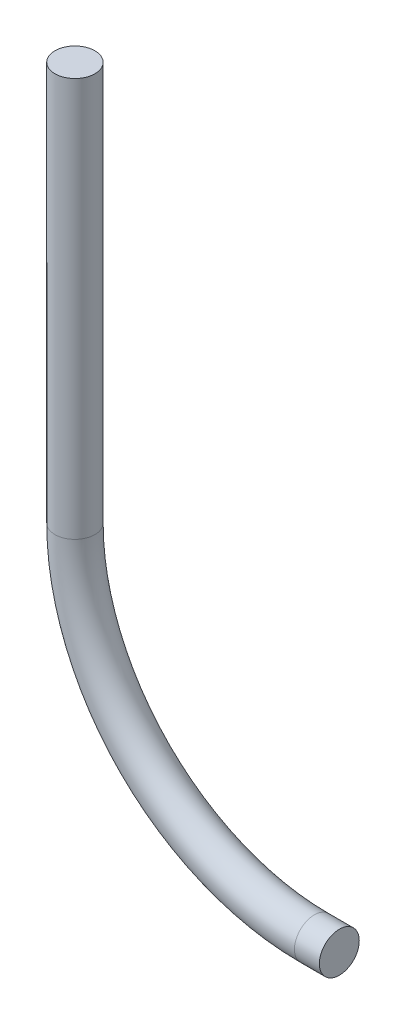
ISO-10303-21;
HEADER;
FILE_DESCRIPTION(('STEP AP214'),'2;1');
FILE_NAME('part.step','',(''),(''),'','','');
FILE_SCHEMA(('AUTOMOTIVE_DESIGN { 1 0 10303 214 1 1 1 1 }'));
ENDSEC;
DATA;
#1=APPLICATION_CONTEXT('core data for automotive mechanical design processes');
#2=APPLICATION_PROTOCOL_DEFINITION('international standard','automotive_design',2000,#1);
#3=PRODUCT_CONTEXT('',#1,'mechanical');
#4=PRODUCT('Part','Part','',(#3));
#5=PRODUCT_RELATED_PRODUCT_CATEGORY('part','',(#4));
#6=PRODUCT_DEFINITION_FORMATION('','',#4);
#7=PRODUCT_DEFINITION_CONTEXT('part definition',#1,'design');
#8=PRODUCT_DEFINITION('design','',#6,#7);
#9=PRODUCT_DEFINITION_SHAPE('','',#8);
#10=(LENGTH_UNIT() NAMED_UNIT(*) SI_UNIT(.MILLI.,.METRE.));
#11=(NAMED_UNIT(*) PLANE_ANGLE_UNIT() SI_UNIT($,.RADIAN.));
#12=(NAMED_UNIT(*) SI_UNIT($,.STERADIAN.) SOLID_ANGLE_UNIT());
#13=UNCERTAINTY_MEASURE_WITH_UNIT(LENGTH_MEASURE(1.E-05),#10,'distance_accuracy_value','');
#14=(GEOMETRIC_REPRESENTATION_CONTEXT(3) GLOBAL_UNCERTAINTY_ASSIGNED_CONTEXT((#13)) GLOBAL_UNIT_ASSIGNED_CONTEXT((#10,
#11,#12)) REPRESENTATION_CONTEXT('',''));
#15=CARTESIAN_POINT('',(0.,0.,0.));
#16=DIRECTION('',(0.,0.,1.));
#17=DIRECTION('',(1.,0.,0.));
#18=AXIS2_PLACEMENT_3D('',#15,#16,#17);
#19=CARTESIAN_POINT('',(0.,0.,0.));
#20=DIRECTION('',(1.,0.,0.));
#21=DIRECTION('',(0.,0.,-1.));
#22=AXIS2_PLACEMENT_3D('',#19,#20,#21);
#23=PLANE('',#22);
#24=CARTESIAN_POINT('',(0.,0.,0.));
#25=DIRECTION('',(1.,0.,0.));
#26=DIRECTION('',(0.,0.,-1.));
#27=AXIS2_PLACEMENT_3D('',#24,#25,#26);
#28=CIRCLE('',#27,4.);
#29=CARTESIAN_POINT('',(0.,0.,-4.));
#30=VERTEX_POINT('',#29);
#31=EDGE_CURVE('E47',#30,#30,#28,.T.);
#32=ORIENTED_EDGE('',*,*,#31,.T.);
#33=EDGE_LOOP('',(#32));
#34=FACE_BOUND('',#33,.T.);
#35=ADVANCED_FACE('F33',(#34),#23,.T.);
#36=CARTESIAN_POINT('',(-53.,128.,0.));
#37=DIRECTION('',(0.,-1.,0.));
#38=DIRECTION('',(0.,0.,-1.));
#39=AXIS2_PLACEMENT_3D('',#36,#37,#38);
#40=PLANE('',#39);
#41=CARTESIAN_POINT('',(-53.,128.,0.));
#42=DIRECTION('',(0.,-1.,0.));
#43=DIRECTION('',(0.,0.,-1.));
#44=AXIS2_PLACEMENT_3D('',#41,#42,#43);
#45=CIRCLE('',#44,4.);
#46=CARTESIAN_POINT('',(-53.,128.,-4.));
#47=VERTEX_POINT('',#46);
#48=EDGE_CURVE('E10',#47,#47,#45,.T.);
#49=ORIENTED_EDGE('',*,*,#48,.F.);
#50=EDGE_LOOP('',(#49));
#51=FACE_BOUND('',#50,.T.);
#52=ADVANCED_FACE('F57',(#51),#40,.F.);
#53=CARTESIAN_POINT('',(0.,0.,0.));
#54=DIRECTION('',(-1.,0.,0.));
#55=DIRECTION('',(0.,-1.,0.));
#56=AXIS2_PLACEMENT_3D('',#53,#54,#55);
#57=CYLINDRICAL_SURFACE('',#56,4.);
#58=CARTESIAN_POINT('',(-5.,0.,0.));
#59=DIRECTION('',(1.,0.,0.));
#60=DIRECTION('',(0.,0.,-1.));
#61=AXIS2_PLACEMENT_3D('',#58,#59,#60);
#62=CIRCLE('',#61,4.);
#63=CARTESIAN_POINT('',(-5.,-4.,0.));
#64=VERTEX_POINT('',#63);
#65=EDGE_CURVE('E43',#64,#64,#62,.T.);
#66=ORIENTED_EDGE('',*,*,#65,.T.);
#67=EDGE_LOOP('',(#66));
#68=FACE_BOUND('',#67,.T.);
#69=ORIENTED_EDGE('',*,*,#31,.F.);
#70=EDGE_LOOP('',(#69));
#71=FACE_BOUND('',#70,.T.);
#72=ADVANCED_FACE('F54',(#68,#71),#57,.T.);
#73=CARTESIAN_POINT('',(-5.00000000000001,48.,0.));
#74=DIRECTION('',(0.,0.,-1.));
#75=DIRECTION('',(-1.,0.,0.));
#76=AXIS2_PLACEMENT_3D('',#73,#74,#75);
#77=TOROIDAL_SURFACE('',#76,48.,4.);
#78=CARTESIAN_POINT('',(-53.,48.,0.));
#79=DIRECTION('',(0.,-1.,0.));
#80=DIRECTION('',(0.,0.,-1.));
#81=AXIS2_PLACEMENT_3D('',#78,#79,#80);
#82=CIRCLE('',#81,4.);
#83=CARTESIAN_POINT('',(-57.,48.,0.));
#84=VERTEX_POINT('',#83);
#85=EDGE_CURVE('E39',#84,#84,#82,.T.);
#86=CARTESIAN_POINT('',(-5.00000000000001,48.,0.));
#87=DIRECTION('',(0.,0.,-1.));
#88=DIRECTION('',(-1.,0.,0.));
#89=AXIS2_PLACEMENT_3D('',#86,#87,#88);
#90=CIRCLE('',#89,52.);
#91=EDGE_CURVE('',#64,#84,#90,.T.);
#92=ORIENTED_EDGE('',*,*,#65,.F.);
#93=ORIENTED_EDGE('',*,*,#85,.T.);
#94=ORIENTED_EDGE('',*,*,#91,.T.);
#95=ORIENTED_EDGE('',*,*,#91,.F.);
#96=EDGE_LOOP('',(#92,#94,#93,#95));
#97=FACE_BOUND('',#96,.T.);
#98=ADVANCED_FACE('F56',(#97),#77,.T.);
#99=CARTESIAN_POINT('',(-53.,48.,0.));
#100=DIRECTION('',(0.,1.,0.));
#101=DIRECTION('',(-1.,0.,0.));
#102=AXIS2_PLACEMENT_3D('',#99,#100,#101);
#103=CYLINDRICAL_SURFACE('',#102,4.);
#104=ORIENTED_EDGE('',*,*,#48,.T.);
#105=EDGE_LOOP('',(#104));
#106=FACE_BOUND('',#105,.T.);
#107=ORIENTED_EDGE('',*,*,#85,.F.);
#108=EDGE_LOOP('',(#107));
#109=FACE_BOUND('',#108,.T.);
#110=ADVANCED_FACE('F64',(#106,#109),#103,.T.);
#111=CLOSED_SHELL('',(#35,#52,#72,#98,#110));
#112=MANIFOLD_SOLID_BREP('B2',#111);
#113=ADVANCED_BREP_SHAPE_REPRESENTATION('',(#18,#112),#14);
#114=SHAPE_DEFINITION_REPRESENTATION(#9,#113);
ENDSEC;
END-ISO-10303-21;
